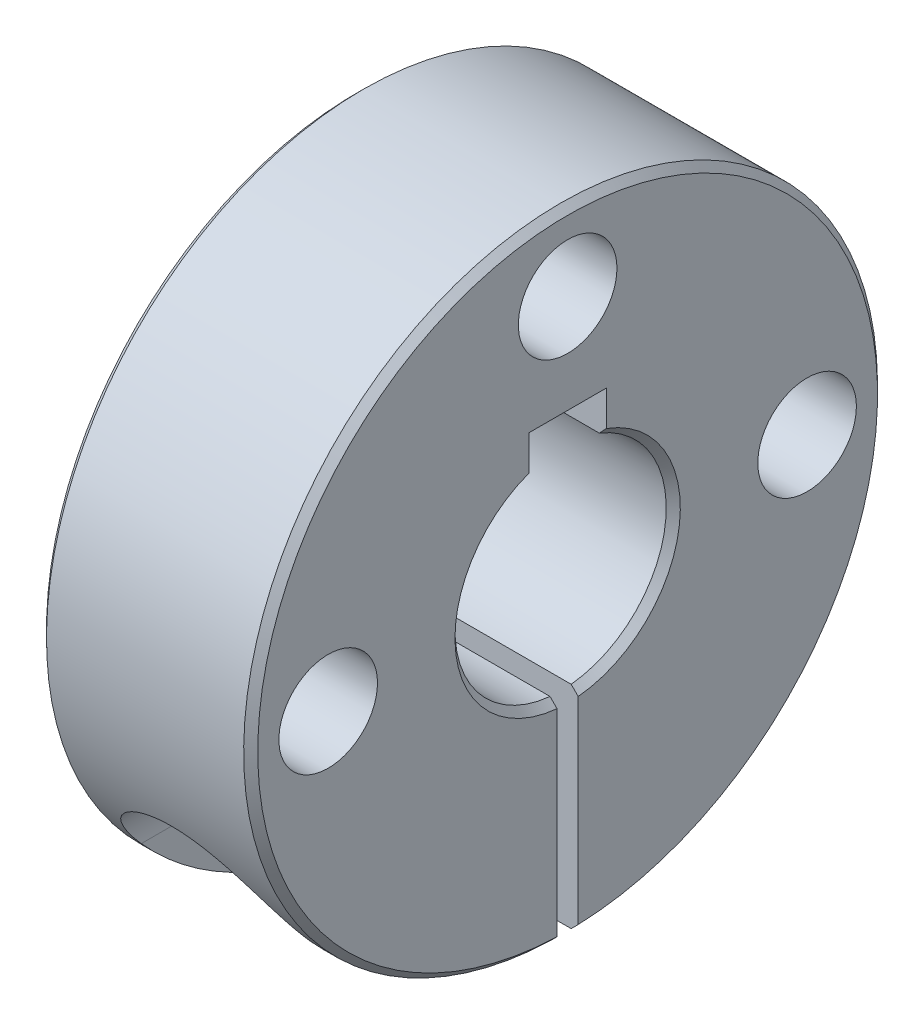
ISO-10303-21;
HEADER;
FILE_DESCRIPTION(('STEP AP214'),'2;1');
FILE_NAME('part.step','',(''),(''),'','','');
FILE_SCHEMA(('AUTOMOTIVE_DESIGN { 1 0 10303 214 1 1 1 1 }'));
ENDSEC;
DATA;
#1=APPLICATION_CONTEXT('core data for automotive mechanical design processes');
#2=APPLICATION_PROTOCOL_DEFINITION('international standard','automotive_design',2000,#1);
#3=PRODUCT_CONTEXT('',#1,'mechanical');
#4=PRODUCT('Part','Part','',(#3));
#5=PRODUCT_RELATED_PRODUCT_CATEGORY('part','',(#4));
#6=PRODUCT_DEFINITION_FORMATION('','',#4);
#7=PRODUCT_DEFINITION_CONTEXT('part definition',#1,'design');
#8=PRODUCT_DEFINITION('design','',#6,#7);
#9=PRODUCT_DEFINITION_SHAPE('','',#8);
#10=(LENGTH_UNIT() NAMED_UNIT(*) SI_UNIT(.MILLI.,.METRE.));
#11=(NAMED_UNIT(*) PLANE_ANGLE_UNIT() SI_UNIT($,.RADIAN.));
#12=(NAMED_UNIT(*) SI_UNIT($,.STERADIAN.) SOLID_ANGLE_UNIT());
#13=UNCERTAINTY_MEASURE_WITH_UNIT(LENGTH_MEASURE(1.E-05),#10,'distance_accuracy_value','');
#14=(GEOMETRIC_REPRESENTATION_CONTEXT(3) GLOBAL_UNCERTAINTY_ASSIGNED_CONTEXT((#13)) GLOBAL_UNIT_ASSIGNED_CONTEXT((#10,
#11,#12)) REPRESENTATION_CONTEXT('',''));
#15=CARTESIAN_POINT('',(0.,0.,0.));
#16=DIRECTION('',(0.,0.,1.));
#17=DIRECTION('',(1.,0.,0.));
#18=AXIS2_PLACEMENT_3D('',#15,#16,#17);
#19=CARTESIAN_POINT('',(7.5,-15.,-19.0328663106743));
#20=DIRECTION('',(0.,0.,-1.));
#21=DIRECTION('',(-1.,0.,0.));
#22=AXIS2_PLACEMENT_3D('',#19,#20,#21);
#23=CYLINDRICAL_SURFACE('',#22,2.4585);
#24=CARTESIAN_POINT('',(7.5,-15.,-0.75));
#25=DIRECTION('',(0.,0.,-1.));
#26=DIRECTION('',(-1.,0.,0.));
#27=AXIS2_PLACEMENT_3D('',#24,#25,#26);
#28=CIRCLE('',#27,2.4585);
#29=CARTESIAN_POINT('',(5.0415,-15.,-0.75));
#30=VERTEX_POINT('',#29);
#31=EDGE_CURVE('E199',#30,#30,#28,.T.);
#32=ORIENTED_EDGE('',*,*,#31,.F.);
#33=EDGE_LOOP('',(#32));
#34=FACE_BOUND('',#33,.T.);
#35=CARTESIAN_POINT('',(5.0415,-15.,-16.7705098312484));
#36=CARTESIAN_POINT('',(5.04149805708887,-14.8448717016041,-16.9092596748891));
#37=CARTESIAN_POINT('',(5.05614646984231,-14.6877579019284,-17.0458876681753));
#38=CARTESIAN_POINT('',(5.11733143065665,-14.3733206651101,-17.3118438136128));
#39=CARTESIAN_POINT('',(5.16386044941971,-14.2159972862183,-17.441173681571));
#40=CARTESIAN_POINT('',(5.2799979301912,-13.934844583986,-17.6662522580199));
#41=CARTESIAN_POINT('',(5.34387438287865,-13.8101247813252,-17.7638320716436));
#42=CARTESIAN_POINT('',(5.49615845072061,-13.568508720336,-17.9490567476726));
#43=CARTESIAN_POINT('',(5.58453358545304,-13.4516023558851,-18.0367145494847));
#44=CARTESIAN_POINT('',(5.76873546397706,-13.2500786427208,-18.1851126199185));
#45=CARTESIAN_POINT('',(5.86062918847246,-13.1633739513742,-18.2478862090267));
#46=CARTESIAN_POINT('',(6.06084648071676,-13.0026233156153,-18.3627759951126));
#47=CARTESIAN_POINT('',(6.16916625545982,-12.9285744571683,-18.4148946459581));
#48=CARTESIAN_POINT('',(6.40123790395823,-12.7966210070645,-18.5068376969926));
#49=CARTESIAN_POINT('',(6.52509564083756,-12.7388369486663,-18.5465705312411));
#50=CARTESIAN_POINT('',(6.78410818676765,-12.6440105328512,-18.6113499386235));
#51=CARTESIAN_POINT('',(6.91925385780343,-12.6069515811748,-18.6364082621623));
#52=CARTESIAN_POINT('',(7.17797979119086,-12.5596002676293,-18.6683459377838));
#53=CARTESIAN_POINT('',(7.30081070348311,-12.5464773927784,-18.6771495151521));
#54=CARTESIAN_POINT('',(7.54728515309059,-12.5388696030744,-18.6822584861454));
#55=CARTESIAN_POINT('',(7.67092829611995,-12.5443762285528,-18.678569552627));
#56=CARTESIAN_POINT('',(7.90696833040265,-12.5726956871567,-18.6595169394049));
#57=CARTESIAN_POINT('',(8.01957130850789,-12.594351038078,-18.6449339848885));
#58=CARTESIAN_POINT('',(8.23899627633861,-12.652450393094,-18.6055561801566));
#59=CARTESIAN_POINT('',(8.34581815307907,-12.6888946861034,-18.5807611304388));
#60=CARTESIAN_POINT('',(8.55454400663269,-12.7761824340762,-18.5208540485657));
#61=CARTESIAN_POINT('',(8.65618326237766,-12.8274472474156,-18.4854387793729));
#62=CARTESIAN_POINT('',(8.84890334037747,-12.9415445839094,-18.40573984105));
#63=CARTESIAN_POINT('',(8.93998051689279,-13.0043810820374,-18.3614531240409));
#64=CARTESIAN_POINT('',(9.11995503494366,-13.1467451838203,-18.2598340534047));
#65=CARTESIAN_POINT('',(9.20748452755103,-13.2273517455965,-18.2015987577938));
#66=CARTESIAN_POINT('',(9.36754963204914,-13.3968491223066,-18.0772094939121));
#67=CARTESIAN_POINT('',(9.44007748612919,-13.4857441891825,-18.0110514563293));
#68=CARTESIAN_POINT('',(9.58145882171293,-13.6850312893006,-17.8602370744533));
#69=CARTESIAN_POINT('',(9.64750948717731,-13.7964828946933,-17.7743600278865));
#70=CARTESIAN_POINT('',(9.75987667623086,-14.023646412335,-17.5956895255932));
#71=CARTESIAN_POINT('',(9.80618086720296,-14.1393609381203,-17.5028917899418));
#72=CARTESIAN_POINT('',(9.88805954143037,-14.3971937938277,-17.2917348502521));
#73=CARTESIAN_POINT('',(9.91925227684726,-14.5396896282218,-17.1721391519792));
#74=CARTESIAN_POINT('',(9.95633455626861,-14.8234885172997,-16.9277694894997));
#75=CARTESIAN_POINT('',(9.96220611579894,-14.9647906530859,-16.802991908324));
#76=CARTESIAN_POINT('',(9.94911631968409,-15.273285969913,-16.5235782007781));
#77=CARTESIAN_POINT('',(9.92461902573518,-15.4396080592885,-16.3682263755974));
#78=CARTESIAN_POINT('',(9.84294988667769,-15.7633781321064,-16.0566661142727));
#79=CARTESIAN_POINT('',(9.78574537643327,-15.9208170708645,-15.9004569766172));
#80=CARTESIAN_POINT('',(9.64314355170367,-16.2150488846174,-15.6001189780964));
#81=CARTESIAN_POINT('',(9.55953603771303,-16.3525068280859,-15.4558085633742));
#82=CARTESIAN_POINT('',(9.41172266071443,-16.5479616536886,-15.2454648488343));
#83=CARTESIAN_POINT('',(9.35873943948631,-16.6113050725796,-15.1763928050696));
#84=CARTESIAN_POINT('',(9.24495727107227,-16.7338793795904,-15.0411298246012));
#85=CARTESIAN_POINT('',(9.18416223116549,-16.7931123010229,-14.9749374695547));
#86=CARTESIAN_POINT('',(9.03655257573315,-16.9223216496664,-14.828922242295));
#87=CARTESIAN_POINT('',(8.94717077788985,-16.9908009887293,-14.750327640932));
#88=CARTESIAN_POINT('',(8.7542294173243,-17.1176447137008,-14.6029333683251));
#89=CARTESIAN_POINT('',(8.65069076362329,-17.1760237344887,-14.5341195514562));
#90=CARTESIAN_POINT('',(8.45474951584272,-17.2674894610327,-14.4252437975103));
#91=CARTESIAN_POINT('',(8.36529441329981,-17.3033037565795,-14.382211736811));
#92=CARTESIAN_POINT('',(8.1785116515811,-17.3650526934325,-14.3075958790189));
#93=CARTESIAN_POINT('',(8.08119543697899,-17.3910013940879,-14.2759957934842));
#94=CARTESIAN_POINT('',(7.89559056034136,-17.4280244286856,-14.230765849737));
#95=CARTESIAN_POINT('',(7.80811726767171,-17.4407389409386,-14.2151599993887));
#96=CARTESIAN_POINT('',(7.63102434494715,-17.4566117369034,-14.195663917851));
#97=CARTESIAN_POINT('',(7.54140603406875,-17.4597757492822,-14.1917666635124));
#98=CARTESIAN_POINT('',(7.36263279581217,-17.456287762876,-14.1960565854325));
#99=CARTESIAN_POINT('',(7.27347801948948,-17.4496327436432,-14.2042474801458));
#100=CARTESIAN_POINT('',(7.09815593651113,-17.4270510829086,-14.2319429359146));
#101=CARTESIAN_POINT('',(7.01199087540931,-17.4111176256079,-14.2514558138883));
#102=CARTESIAN_POINT('',(6.82284127304091,-17.3658862958975,-14.3065563340953));
#103=CARTESIAN_POINT('',(6.72126659746349,-17.3341984394044,-14.3449953994239));
#104=CARTESIAN_POINT('',(6.52754825135905,-17.2603896534046,-14.4337202546322));
#105=CARTESIAN_POINT('',(6.43542209422198,-17.2182498275037,-14.4840274931615));
#106=CARTESIAN_POINT('',(6.22295388233147,-17.1055850002505,-14.6170942586383));
#107=CARTESIAN_POINT('',(6.10782912798329,-17.0306957368097,-14.7044383285141));
#108=CARTESIAN_POINT('',(5.89674053255204,-16.8685716688077,-14.8901501919138));
#109=CARTESIAN_POINT('',(5.80082134331074,-16.7813088822863,-14.9885428632416));
#110=CARTESIAN_POINT('',(5.65140964301487,-16.6233222694923,-15.1632743506445));
#111=CARTESIAN_POINT('',(5.59357653982828,-16.5548623103737,-15.2380196772147));
#112=CARTESIAN_POINT('',(5.48672723057693,-16.4137856094124,-15.389880256801));
#113=CARTESIAN_POINT('',(5.43771495389347,-16.34116703394,-15.466996548181));
#114=CARTESIAN_POINT('',(5.30353964895295,-16.1180046417889,-15.7005106810989));
#115=CARTESIAN_POINT('',(5.23111192831988,-15.962016929163,-15.8592266012985));
#116=CARTESIAN_POINT('',(5.13150338194107,-15.6728543038539,-16.144476483264));
#117=CARTESIAN_POINT('',(5.09806720606707,-15.5416211576268,-16.270887259593));
#118=CARTESIAN_POINT('',(5.05307042057751,-15.2741132936722,-16.5222600470746));
#119=CARTESIAN_POINT('',(5.04150172638882,-15.1378404581611,-16.6472225766664));
#120=CARTESIAN_POINT('',(5.0415,-15.,-16.7705098312484));
#121=B_SPLINE_CURVE_WITH_KNOTS('',3,(#35,#36,#37,#38,#39,#40,#41,#42,#43,#44,#45,#46,#47,#48,
#49,#50,#51,#52,#53,#54,#55,#56,#57,#58,#59,#60,#61,#62,#63,#64,#65,#66,#67,#68,#69,#70,#71,#72,
#73,#74,#75,#76,#77,#78,#79,#80,#81,#82,#83,#84,#85,#86,#87,#88,#89,#90,#91,#92,#93,#94,#95,#96,
#97,#98,#99,#100,#101,#102,#103,#104,#105,#106,#107,#108,#109,#110,#111,#112,#113,#114,#115,
#116,#117,#118,#119,#120),.UNSPECIFIED.,.T.,.F.,(4,2,2,2,2,2,2,2,2,2,2,2,2,2,2,2,2,2,2,2,2,2,2,
2,2,2,2,2,2,2,2,2,2,2,2,2,2,2,2,2,2,2,4),(0.,0.623879036716698,1.24761078160696,
1.75797422055942,2.26766422794611,2.68919245338355,3.11062348983253,3.53509999062979,
3.95923613152967,4.32879860815748,4.69819328874839,5.04338645417141,5.38858636356693,
5.74477274426176,6.1010817070546,6.49700018532095,6.89312289618155,7.35772612573821,
7.82261909876417,8.38646625926096,8.95071382874173,9.63473611760575,10.3194427449652,
10.9651811988314,11.287833395699,11.6103248335522,12.0210873456447,12.4312496051375,
12.7467203400178,13.0617398007366,13.3298220334422,13.5977434306571,13.8657472607772,
14.1339482112132,14.4714787016418,14.809623928214,15.2952434005887,15.7819791252261,
16.1316288004162,16.4814338493037,17.1803292166457,17.734886859709,18.2892394384928),.UNSPECIFIED.);
#122=CARTESIAN_POINT('',(5.0415,-15.,-16.7705098312484));
#123=VERTEX_POINT('',#122);
#124=EDGE_CURVE('E245',#123,#123,#121,.F.);
#125=ORIENTED_EDGE('',*,*,#124,.F.);
#126=EDGE_LOOP('',(#125));
#127=FACE_BOUND('',#126,.T.);
#128=ADVANCED_FACE('F17',(#34,#127),#23,.F.);
#129=CARTESIAN_POINT('',(7.5,-15.,8.));
#130=DIRECTION('',(0.,0.,1.));
#131=DIRECTION('',(1.,0.,0.));
#132=AXIS2_PLACEMENT_3D('',#129,#130,#131);
#133=PLANE('',#132);
#134=DIRECTION('',(0.,1.,0.));
#135=VECTOR('',#134,1.);
#136=CARTESIAN_POINT('',(13.5,-45.,8.));
#137=LINE('',#136,#135);
#138=CARTESIAN_POINT('',(13.5,-21.0297408448131,8.));
#139=VERTEX_POINT('',#138);
#140=CARTESIAN_POINT('',(13.5,-15.,8.));
#141=VERTEX_POINT('',#140);
#142=EDGE_CURVE('E10',#139,#141,#137,.T.);
#143=ORIENTED_EDGE('',*,*,#142,.T.);
#144=CARTESIAN_POINT('',(7.5,-15.,8.));
#145=DIRECTION('',(0.,0.,1.));
#146=DIRECTION('',(1.,0.,0.));
#147=AXIS2_PLACEMENT_3D('',#144,#145,#146);
#148=CIRCLE('',#147,6.);
#149=CARTESIAN_POINT('',(1.5,-15.,8.));
#150=VERTEX_POINT('',#149);
#151=EDGE_CURVE('E313',#141,#150,#148,.T.);
#152=ORIENTED_EDGE('',*,*,#151,.T.);
#153=DIRECTION('',(0.,-1.,0.));
#154=VECTOR('',#153,1.);
#155=CARTESIAN_POINT('',(1.5,-15.,8.));
#156=LINE('',#155,#154);
#157=CARTESIAN_POINT('',(1.5,-21.0297408448131,8.));
#158=VERTEX_POINT('',#157);
#159=EDGE_CURVE('E34',#150,#158,#156,.T.);
#160=ORIENTED_EDGE('',*,*,#159,.T.);
#161=DIRECTION('',(-1.,0.,0.));
#162=VECTOR('',#161,1.);
#163=CARTESIAN_POINT('',(15.,-21.0297408448131,8.));
#164=LINE('',#163,#162);
#165=EDGE_CURVE('E254',#139,#158,#164,.T.);
#166=ORIENTED_EDGE('',*,*,#165,.F.);
#167=EDGE_LOOP('',(#143,#152,#160,#166));
#168=FACE_BOUND('',#167,.T.);
#169=CARTESIAN_POINT('',(7.5,-15.,8.));
#170=DIRECTION('',(0.,0.,1.));
#171=DIRECTION('',(1.,0.,0.));
#172=AXIS2_PLACEMENT_3D('',#169,#170,#171);
#173=CIRCLE('',#172,3.5);
#174=CARTESIAN_POINT('',(11.,-15.,8.));
#175=VERTEX_POINT('',#174);
#176=EDGE_CURVE('E253',#175,#175,#173,.T.);
#177=ORIENTED_EDGE('',*,*,#176,.F.);
#178=EDGE_LOOP('',(#177));
#179=FACE_BOUND('',#178,.T.);
#180=ADVANCED_FACE('F19',(#168,#179),#133,.T.);
#181=CARTESIAN_POINT('',(13.5,-45.,30.5));
#182=DIRECTION('',(-1.,0.,0.));
#183=DIRECTION('',(0.,0.,1.));
#184=AXIS2_PLACEMENT_3D('',#181,#182,#183);
#185=PLANE('',#184);
#186=DIRECTION('',(0.,0.,-1.));
#187=VECTOR('',#186,1.);
#188=CARTESIAN_POINT('',(13.5,-15.,30.5));
#189=LINE('',#188,#187);
#190=CARTESIAN_POINT('',(13.5,-15.,16.7705098312484));
#191=VERTEX_POINT('',#190);
#192=EDGE_CURVE('E243',#191,#141,#189,.T.);
#193=ORIENTED_EDGE('',*,*,#192,.T.);
#194=ORIENTED_EDGE('',*,*,#142,.F.);
#195=CARTESIAN_POINT('',(13.5,0.,0.));
#196=DIRECTION('',(1.,0.,0.));
#197=DIRECTION('',(0.,0.,1.));
#198=AXIS2_PLACEMENT_3D('',#195,#196,#197);
#199=CIRCLE('',#198,22.5);
#200=EDGE_CURVE('E310',#191,#139,#199,.T.);
#201=ORIENTED_EDGE('',*,*,#200,.F.);
#202=EDGE_LOOP('',(#193,#194,#201));
#203=FACE_BOUND('',#202,.T.);
#204=ADVANCED_FACE('F300',(#203),#185,.T.);
#205=CARTESIAN_POINT('',(1.5,-15.,30.5));
#206=DIRECTION('',(1.,0.,0.));
#207=DIRECTION('',(0.,1.,0.));
#208=AXIS2_PLACEMENT_3D('',#205,#206,#207);
#209=PLANE('',#208);
#210=ORIENTED_EDGE('',*,*,#159,.F.);
#211=DIRECTION('',(0.,0.,-1.));
#212=VECTOR('',#211,1.);
#213=CARTESIAN_POINT('',(1.5,-15.,30.5));
#214=LINE('',#213,#212);
#215=CARTESIAN_POINT('',(1.5,-15.,16.7705098312484));
#216=VERTEX_POINT('',#215);
#217=EDGE_CURVE('E63',#216,#150,#214,.T.);
#218=ORIENTED_EDGE('',*,*,#217,.F.);
#219=CARTESIAN_POINT('',(1.5,0.,0.));
#220=DIRECTION('',(-1.,0.,0.));
#221=DIRECTION('',(0.,0.,-1.));
#222=AXIS2_PLACEMENT_3D('',#219,#220,#221);
#223=CIRCLE('',#222,22.5);
#224=EDGE_CURVE('E502',#158,#216,#223,.T.);
#225=ORIENTED_EDGE('',*,*,#224,.F.);
#226=EDGE_LOOP('',(#210,#218,#225));
#227=FACE_BOUND('',#226,.T.);
#228=ADVANCED_FACE('F297',(#227),#209,.T.);
#229=CARTESIAN_POINT('',(7.5,-15.,30.5));
#230=DIRECTION('',(0.,0.,-1.));
#231=DIRECTION('',(-1.,0.,0.));
#232=AXIS2_PLACEMENT_3D('',#229,#230,#231);
#233=CYLINDRICAL_SURFACE('',#232,6.);
#234=ORIENTED_EDGE('',*,*,#217,.T.);
#235=ORIENTED_EDGE('',*,*,#151,.F.);
#236=ORIENTED_EDGE('',*,*,#192,.F.);
#237=CARTESIAN_POINT('',(1.5,-15.,16.7705098312484));
#238=CARTESIAN_POINT('',(1.500000951378,-14.8106485336108,16.9399303869875));
#239=CARTESIAN_POINT('',(1.50896822754426,-14.6182594467692,17.1061766364176));
#240=CARTESIAN_POINT('',(1.5465540069012,-14.2287222697893,17.4315077661411));
#241=CARTESIAN_POINT('',(1.57521406234586,-14.0315649689206,17.5905767444434));
#242=CARTESIAN_POINT('',(1.6541470620048,-13.6334700076549,17.9009129863554));
#243=CARTESIAN_POINT('',(1.7045446792961,-13.4325170337583,18.0521295208695));
#244=CARTESIAN_POINT('',(1.82853841724849,-13.0305610184167,18.3443744353908));
#245=CARTESIAN_POINT('',(1.90211208711868,-12.8295582127447,18.4854125135012));
#246=CARTESIAN_POINT('',(2.04934660318448,-12.4871170924922,18.7176865699939));
#247=CARTESIAN_POINT('',(2.11704864842377,-12.3449743947352,18.8116908607258));
#248=CARTESIAN_POINT('',(2.26531302121939,-12.0634465533976,18.993454117618));
#249=CARTESIAN_POINT('',(2.34587227724981,-11.9240607601219,19.0812145681805));
#250=CARTESIAN_POINT('',(2.51979840606387,-11.6497919129206,19.2498886023095));
#251=CARTESIAN_POINT('',(2.61313284517025,-11.5148984989149,19.330818711431));
#252=CARTESIAN_POINT('',(2.81266617821384,-11.2508305862209,19.4856929714747));
#253=CARTESIAN_POINT('',(2.91885900473657,-11.1216534292231,19.559640388188));
#254=CARTESIAN_POINT('',(3.14464899244731,-10.8696567884864,19.7008012291793));
#255=CARTESIAN_POINT('',(3.26433462571748,-10.7468880320955,19.7679639929865));
#256=CARTESIAN_POINT('',(3.51596065486526,-10.5103175447491,19.8947541572559));
#257=CARTESIAN_POINT('',(3.6479013738643,-10.3965160503735,19.9543813589352));
#258=CARTESIAN_POINT('',(3.92330301678877,-10.1794192319558,20.0659995396789));
#259=CARTESIAN_POINT('',(4.06676999173333,-10.0761294916912,20.1179864667217));
#260=CARTESIAN_POINT('',(4.36410436863273,-9.88163030343239,20.2142317212676));
#261=CARTESIAN_POINT('',(4.51797068758685,-9.79041960043092,20.2584908518383));
#262=CARTESIAN_POINT('',(4.81899801192788,-9.62986415729205,20.3352607036786));
#263=CARTESIAN_POINT('',(4.96529500793038,-9.55924555196308,20.3685031765892));
#264=CARTESIAN_POINT('',(5.26422140473049,-9.42973785811279,20.4287823833869));
#265=CARTESIAN_POINT('',(5.4168504284813,-9.37084807239524,20.4558194861544));
#266=CARTESIAN_POINT('',(5.72721320444403,-9.26553653739653,20.5037357949938));
#267=CARTESIAN_POINT('',(5.8849446970508,-9.21910935156107,20.5246176865421));
#268=CARTESIAN_POINT('',(6.20433785789574,-9.13925313667977,20.5603007964319));
#269=CARTESIAN_POINT('',(6.36599942777311,-9.10582378268317,20.5751021667893));
#270=CARTESIAN_POINT('',(6.68323185309016,-9.05379704496159,20.5980465361597));
#271=CARTESIAN_POINT('',(6.83866611032946,-9.0345020996416,20.6065032730439));
#272=CARTESIAN_POINT('',(7.1508202120985,-9.0081210095459,20.6180495000821));
#273=CARTESIAN_POINT('',(7.30754046571617,-9.00103891407458,20.6211372100791));
#274=CARTESIAN_POINT('',(7.6209950058462,-8.99917388674504,20.6219511699819));
#275=CARTESIAN_POINT('',(7.77772925266206,-9.00438529260769,20.6196798881923));
#276=CARTESIAN_POINT('',(8.0901985457147,-9.02704330811364,20.6097705401234));
#277=CARTESIAN_POINT('',(8.24593320345961,-9.04449441478249,20.6021305012908));
#278=CARTESIAN_POINT('',(8.55314553943211,-9.09113370934588,20.5815919230412));
#279=CARTESIAN_POINT('',(8.70465229237643,-9.12016216308867,20.568764916662));
#280=CARTESIAN_POINT('',(9.00452520719865,-9.18965574771392,20.5378108112651));
#281=CARTESIAN_POINT('',(9.15289021511799,-9.23012500507189,20.5196817998358));
#282=CARTESIAN_POINT('',(9.445359460735,-9.32205427341683,20.4780820906554));
#283=CARTESIAN_POINT('',(9.58946483826172,-9.37351131332606,20.4546128367845));
#284=CARTESIAN_POINT('',(9.87249438231509,-9.48687828442112,20.4022801462557));
#285=CARTESIAN_POINT('',(10.0114183573074,-9.54878860155337,20.3734165104271));
#286=CARTESIAN_POINT('',(10.284441172298,-9.68302335225503,20.3099635037517));
#287=CARTESIAN_POINT('',(10.4184835179041,-9.75543878812797,20.2753236569052));
#288=CARTESIAN_POINT('',(10.6795440407783,-9.90947244139627,20.2004872223853));
#289=CARTESIAN_POINT('',(10.8065620509324,-9.99109087759732,20.1602905025895));
#290=CARTESIAN_POINT('',(11.0528334610747,-10.1626563727496,20.0743521796826));
#291=CARTESIAN_POINT('',(11.1720876976641,-10.2526025317917,20.0286111755325));
#292=CARTESIAN_POINT('',(11.4022817632459,-10.4399312569512,19.9316071096954));
#293=CARTESIAN_POINT('',(11.5132186514118,-10.5373164289939,19.8803421103178));
#294=CARTESIAN_POINT('',(11.7304596536649,-10.7424885449642,19.7702558689777));
#295=CARTESIAN_POINT('',(11.8364087365686,-10.8505342001137,19.7112164176583));
#296=CARTESIAN_POINT('',(12.0384164053606,-11.0724936750401,19.587394865546));
#297=CARTESIAN_POINT('',(12.1344713706022,-11.18640962027,19.5226106785528));
#298=CARTESIAN_POINT('',(12.3163908223684,-11.4189163619954,19.3875324380788));
#299=CARTESIAN_POINT('',(12.4022591405716,-11.5375053782246,19.3172404729594));
#300=CARTESIAN_POINT('',(12.5637997061125,-11.7783588458332,19.1713354359286));
#301=CARTESIAN_POINT('',(12.6394681884482,-11.9006246341393,19.0957204147428));
#302=CARTESIAN_POINT('',(12.7872259639653,-12.159322812498,18.9321523902744));
#303=CARTESIAN_POINT('',(12.8583214257917,-12.2960120459913,18.8437065948681));
#304=CARTESIAN_POINT('',(12.9885983796461,-12.5713150873427,18.6611736383502));
#305=CARTESIAN_POINT('',(13.0477752057805,-12.7099296263053,18.56708428654));
#306=CARTESIAN_POINT('',(13.2080092666898,-13.1272048232357,18.2767856738779));
#307=CARTESIAN_POINT('',(13.2917058071295,-13.4071817341308,18.0726182088251));
#308=CARTESIAN_POINT('',(13.4044714321253,-13.9090873532804,17.6880564702358));
#309=CARTESIAN_POINT('',(13.4409729964909,-14.131774786029,17.5106962881796));
#310=CARTESIAN_POINT('',(13.4767829159723,-14.4612969678006,17.2377823659765));
#311=CARTESIAN_POINT('',(13.4855636823528,-14.5701794103981,17.1458503238178));
#312=CARTESIAN_POINT('',(13.497171277786,-14.7863434128641,16.9597880328878));
#313=CARTESIAN_POINT('',(13.4999990940654,-14.8936252352459,16.8656581512207));
#314=CARTESIAN_POINT('',(13.5,-15.,16.7705098312484));
#315=B_SPLINE_CURVE_WITH_KNOTS('',3,(#237,#238,#239,#240,#241,#242,#243,#244,#245,#246,#247,
#248,#249,#250,#251,#252,#253,#254,#255,#256,#257,#258,#259,#260,#261,#262,#263,#264,#265,#266,
#267,#268,#269,#270,#271,#272,#273,#274,#275,#276,#277,#278,#279,#280,#281,#282,#283,#284,#285,
#286,#287,#288,#289,#290,#291,#292,#293,#294,#295,#296,#297,#298,#299,#300,#301,#302,#303,#304,
#305,#306,#307,#308,#309,#310,#311,#312,#313,#314),.UNSPECIFIED.,.F.,.F.,(4,2,2,2,2,2,2,2,2,2,2,
2,2,2,2,2,2,2,2,2,2,2,2,2,2,2,2,2,2,2,2,2,2,2,2,2,2,2,4),(0.,0.762272128167132,1.52615762867283,
2.29448380400111,3.06206797387398,3.61166034808455,4.16112162330426,4.70921294144387,
5.25704663537299,5.80870804953565,6.36038401310776,6.91235151045024,7.4642616135149,
7.96107534323943,8.45785953204481,8.9544266554264,9.45098136364176,9.92098211404376,
10.3911386684114,10.8610787150686,11.3311915143322,11.7950308527549,12.2590377029248,
12.7229192449517,13.1868179177387,13.6550060981414,14.1232054122885,14.5913541908731,
15.0596677232109,15.5464428176735,16.0333954141353,16.5201642600395,17.0071122947264,
17.5395257846583,18.0721472997945,19.1378377151753,19.9975155960076,20.4256971977294,
20.8538077849794),.UNSPECIFIED.);
#316=EDGE_CURVE('E21',#216,#191,#315,.T.);
#317=ORIENTED_EDGE('',*,*,#316,.F.);
#318=EDGE_LOOP('',(#234,#235,#236,#317));
#319=FACE_BOUND('',#318,.T.);
#320=ADVANCED_FACE('F293',(#319),#233,.F.);
#321=CARTESIAN_POINT('',(15.,10.,-2.75));
#322=DIRECTION('',(0.,-1.,0.));
#323=DIRECTION('',(0.,0.,-1.));
#324=AXIS2_PLACEMENT_3D('',#321,#322,#323);
#325=PLANE('',#324);
#326=DIRECTION('',(0.,0.,1.));
#327=VECTOR('',#326,1.);
#328=CARTESIAN_POINT('',(0.,10.,-2.75));
#329=LINE('',#328,#327);
#330=CARTESIAN_POINT('',(0.,10.,-2.75));
#331=VERTEX_POINT('',#330);
#332=CARTESIAN_POINT('',(0.,10.,2.75));
#333=VERTEX_POINT('',#332);
#334=EDGE_CURVE('E333',#331,#333,#329,.T.);
#335=ORIENTED_EDGE('',*,*,#334,.F.);
#336=DIRECTION('',(-1.,0.,0.));
#337=VECTOR('',#336,1.);
#338=CARTESIAN_POINT('',(15.,10.,-2.75));
#339=LINE('',#338,#337);
#340=CARTESIAN_POINT('',(15.,10.,-2.75));
#341=VERTEX_POINT('',#340);
#342=EDGE_CURVE('E198',#341,#331,#339,.T.);
#343=ORIENTED_EDGE('',*,*,#342,.F.);
#344=DIRECTION('',(0.,0.,1.));
#345=VECTOR('',#344,1.);
#346=CARTESIAN_POINT('',(15.,10.,-2.75));
#347=LINE('',#346,#345);
#348=CARTESIAN_POINT('',(15.,10.,2.75));
#349=VERTEX_POINT('',#348);
#350=EDGE_CURVE('E202',#341,#349,#347,.T.);
#351=ORIENTED_EDGE('',*,*,#350,.T.);
#352=DIRECTION('',(-1.,0.,0.));
#353=VECTOR('',#352,1.);
#354=CARTESIAN_POINT('',(15.,10.,2.75));
#355=LINE('',#354,#353);
#356=EDGE_CURVE('E186',#349,#333,#355,.T.);
#357=ORIENTED_EDGE('',*,*,#356,.T.);
#358=EDGE_LOOP('',(#335,#343,#351,#357));
#359=FACE_BOUND('',#358,.T.);
#360=ADVANCED_FACE('F203',(#359),#325,.T.);
#361=CARTESIAN_POINT('',(15.,0.,-2.75));
#362=DIRECTION('',(0.,0.,1.));
#363=DIRECTION('',(1.,0.,0.));
#364=AXIS2_PLACEMENT_3D('',#361,#362,#363);
#365=PLANE('',#364);
#366=DIRECTION('',(-1.,0.,0.));
#367=VECTOR('',#366,1.);
#368=CARTESIAN_POINT('',(15.,6.97764286847643,-2.75));
#369=LINE('',#368,#367);
#370=CARTESIAN_POINT('',(14.5,6.97764286847643,-2.75));
#371=VERTEX_POINT('',#370);
#372=CARTESIAN_POINT('',(0.5,6.97764286847643,-2.75));
#373=VERTEX_POINT('',#372);
#374=EDGE_CURVE('E327',#371,#373,#369,.T.);
#375=ORIENTED_EDGE('',*,*,#374,.F.);
#376=CARTESIAN_POINT('',(15.,7.51248960065836,-2.75));
#377=CARTESIAN_POINT('',(14.832926295652,7.33457392877952,-2.75));
#378=CARTESIAN_POINT('',(14.6662306403141,7.15631779149213,-2.75));
#379=CARTESIAN_POINT('',(14.5,6.97764286847643,-2.75));
#380=B_SPLINE_CURVE_WITH_KNOTS('',3,(#376,#377,#378,#379),.UNSPECIFIED.,.F.,.F.,(4,4),
(1.0223492895291E-06,0.000733057601059994),.UNSPECIFIED.);
#381=CARTESIAN_POINT('',(15.,7.51248960065836,-2.75));
#382=VERTEX_POINT('',#381);
#383=EDGE_CURVE('E407',#382,#371,#380,.T.);
#384=ORIENTED_EDGE('',*,*,#383,.F.);
#385=DIRECTION('',(0.,1.,0.));
#386=VECTOR('',#385,1.);
#387=CARTESIAN_POINT('',(15.,0.,-2.75));
#388=LINE('',#387,#386);
#389=EDGE_CURVE('E207',#382,#341,#388,.T.);
#390=ORIENTED_EDGE('',*,*,#389,.T.);
#391=ORIENTED_EDGE('',*,*,#342,.T.);
#392=DIRECTION('',(0.,1.,0.));
#393=VECTOR('',#392,1.);
#394=CARTESIAN_POINT('',(0.,0.,-2.75));
#395=LINE('',#394,#393);
#396=CARTESIAN_POINT('',(0.,7.51248960065836,-2.75));
#397=VERTEX_POINT('',#396);
#398=EDGE_CURVE('E362',#397,#331,#395,.T.);
#399=ORIENTED_EDGE('',*,*,#398,.F.);
#400=CARTESIAN_POINT('',(0.5,6.97764286847643,-2.75));
#401=CARTESIAN_POINT('',(0.333776706221638,7.15630989498333,-2.75));
#402=CARTESIAN_POINT('',(0.167080597829464,7.33456658795715,-2.75));
#403=CARTESIAN_POINT('',(0.,7.51248960065837,-2.75));
#404=B_SPLINE_CURVE_WITH_KNOTS('',3,(#400,#401,#402,#403),.UNSPECIFIED.,.F.,.F.,(4,4),
(0.00859991918946598,0.00933358809477891),.UNSPECIFIED.);
#405=EDGE_CURVE('E385',#373,#397,#404,.T.);
#406=ORIENTED_EDGE('',*,*,#405,.F.);
#407=EDGE_LOOP('',(#375,#384,#390,#391,#399,#406));
#408=FACE_BOUND('',#407,.T.);
#409=ADVANCED_FACE('F288',(#408),#365,.T.);
#410=CARTESIAN_POINT('',(15.,10.,2.75));
#411=DIRECTION('',(0.,0.,-1.));
#412=DIRECTION('',(0.,-1.,0.));
#413=AXIS2_PLACEMENT_3D('',#410,#411,#412);
#414=PLANE('',#413);
#415=DIRECTION('',(0.,-1.,0.));
#416=VECTOR('',#415,1.);
#417=CARTESIAN_POINT('',(0.,10.,2.75));
#418=LINE('',#417,#416);
#419=CARTESIAN_POINT('',(0.,7.51248960065836,2.75));
#420=VERTEX_POINT('',#419);
#421=EDGE_CURVE('E193',#333,#420,#418,.T.);
#422=ORIENTED_EDGE('',*,*,#421,.F.);
#423=ORIENTED_EDGE('',*,*,#356,.F.);
#424=DIRECTION('',(0.,-1.,0.));
#425=VECTOR('',#424,1.);
#426=CARTESIAN_POINT('',(15.,10.,2.75));
#427=LINE('',#426,#425);
#428=CARTESIAN_POINT('',(15.,7.51248960065836,2.75));
#429=VERTEX_POINT('',#428);
#430=EDGE_CURVE('E190',#349,#429,#427,.T.);
#431=ORIENTED_EDGE('',*,*,#430,.T.);
#432=CARTESIAN_POINT('',(14.5,6.97764286847643,2.75));
#433=CARTESIAN_POINT('',(14.6662232937784,7.15630989498333,2.75));
#434=CARTESIAN_POINT('',(14.8329194021705,7.33456658795715,2.75));
#435=CARTESIAN_POINT('',(15.,7.51248960065837,2.75));
#436=B_SPLINE_CURVE_WITH_KNOTS('',3,(#432,#433,#434,#435),.UNSPECIFIED.,.F.,.F.,(4,4),
(0.00859991918946597,0.0093335880947789),.UNSPECIFIED.);
#437=CARTESIAN_POINT('',(14.5,6.97764286847643,2.75));
#438=VERTEX_POINT('',#437);
#439=EDGE_CURVE('E400',#438,#429,#436,.T.);
#440=ORIENTED_EDGE('',*,*,#439,.F.);
#441=DIRECTION('',(1.,0.,0.));
#442=VECTOR('',#441,1.);
#443=CARTESIAN_POINT('',(15.,6.97764286847643,2.75));
#444=LINE('',#443,#442);
#445=CARTESIAN_POINT('',(0.5,6.97764286847643,2.75));
#446=VERTEX_POINT('',#445);
#447=EDGE_CURVE('E387',#446,#438,#444,.T.);
#448=ORIENTED_EDGE('',*,*,#447,.F.);
#449=CARTESIAN_POINT('',(0.,7.51248960065836,2.75));
#450=CARTESIAN_POINT('',(0.167073704347987,7.33457392877952,2.75));
#451=CARTESIAN_POINT('',(0.333769359685857,7.15631779149213,2.75));
#452=CARTESIAN_POINT('',(0.5,6.97764286847643,2.75));
#453=B_SPLINE_CURVE_WITH_KNOTS('',3,(#449,#450,#451,#452),.UNSPECIFIED.,.F.,.F.,(4,4),
(1.02234928952702E-06,0.000733057601059993),.UNSPECIFIED.);
#454=EDGE_CURVE('E380',#420,#446,#453,.T.);
#455=ORIENTED_EDGE('',*,*,#454,.F.);
#456=EDGE_LOOP('',(#422,#423,#431,#440,#448,#455));
#457=FACE_BOUND('',#456,.T.);
#458=ADVANCED_FACE('F188',(#457),#414,.T.);
#459=CARTESIAN_POINT('',(15.,0.,0.75));
#460=DIRECTION('',(0.,0.,-1.));
#461=DIRECTION('',(0.,-1.,0.));
#462=AXIS2_PLACEMENT_3D('',#459,#460,#461);
#463=PLANE('',#462);
#464=DIRECTION('',(-1.,0.,0.));
#465=VECTOR('',#464,1.);
#466=CARTESIAN_POINT('',(15.,-7.46240577829965,0.75));
#467=LINE('',#466,#465);
#468=CARTESIAN_POINT('',(14.5,-7.46240577829965,0.75));
#469=VERTEX_POINT('',#468);
#470=CARTESIAN_POINT('',(0.5,-7.46240577829965,0.75));
#471=VERTEX_POINT('',#470);
#472=EDGE_CURVE('E395',#469,#471,#467,.T.);
#473=ORIENTED_EDGE('',*,*,#472,.F.);
#474=CARTESIAN_POINT('',(15.,-7.96476616103699,0.75));
#475=CARTESIAN_POINT('',(14.8333085545415,-7.79733732047774,0.75));
#476=CARTESIAN_POINT('',(14.6666402279217,-7.62988550890442,0.75));
#477=CARTESIAN_POINT('',(14.5,-7.46240577829965,0.75));
#478=B_SPLINE_CURVE_WITH_KNOTS('',3,(#474,#475,#476,#477),.UNSPECIFIED.,.F.,.F.,(4,4),
(0.0113485385099862,0.012057316041416),.UNSPECIFIED.);
#479=CARTESIAN_POINT('',(15.,-7.96476616103699,0.75));
#480=VERTEX_POINT('',#479);
#481=EDGE_CURVE('E403',#480,#469,#478,.T.);
#482=ORIENTED_EDGE('',*,*,#481,.F.);
#483=DIRECTION('',(0.,-1.,0.));
#484=VECTOR('',#483,1.);
#485=CARTESIAN_POINT('',(15.,0.,0.75));
#486=LINE('',#485,#484);
#487=CARTESIAN_POINT('',(15.,-21.987212192545,0.75));
#488=VERTEX_POINT('',#487);
#489=EDGE_CURVE('E215',#480,#488,#486,.T.);
#490=ORIENTED_EDGE('',*,*,#489,.T.);
#491=DIRECTION('',(0.706910226135865,0.707303281615843,0.));
#492=VECTOR('',#491,1.);
#493=CARTESIAN_POINT('',(14.7500007995677,-22.2373551581168,0.75));
#494=LINE('',#493,#492);
#495=CARTESIAN_POINT('',(14.5,-22.4874965258474,0.75));
#496=VERTEX_POINT('',#495);
#497=EDGE_CURVE('E423',#496,#488,#494,.T.);
#498=ORIENTED_EDGE('',*,*,#497,.F.);
#499=DIRECTION('',(1.,0.,0.));
#500=VECTOR('',#499,1.);
#501=CARTESIAN_POINT('',(15.,-22.4874965258474,0.75));
#502=LINE('',#501,#500);
#503=CARTESIAN_POINT('',(0.5,-22.4874965258474,0.75));
#504=VERTEX_POINT('',#503);
#505=EDGE_CURVE('E494',#504,#496,#502,.T.);
#506=ORIENTED_EDGE('',*,*,#505,.F.);
#507=DIRECTION('',(0.70690118372052,-0.707312318890692,0.));
#508=VECTOR('',#507,1.);
#509=CARTESIAN_POINT('',(0.249999200635407,-22.23735515832,0.75));
#510=LINE('',#509,#508);
#511=CARTESIAN_POINT('',(0.,-21.987212192545,0.75));
#512=VERTEX_POINT('',#511);
#513=EDGE_CURVE('E343',#512,#504,#510,.T.);
#514=ORIENTED_EDGE('',*,*,#513,.F.);
#515=DIRECTION('',(0.,-1.,0.));
#516=VECTOR('',#515,1.);
#517=CARTESIAN_POINT('',(0.,0.,0.75));
#518=LINE('',#517,#516);
#519=CARTESIAN_POINT('',(0.,-7.96476616103699,0.75));
#520=VERTEX_POINT('',#519);
#521=EDGE_CURVE('E334',#520,#512,#518,.T.);
#522=ORIENTED_EDGE('',*,*,#521,.F.);
#523=CARTESIAN_POINT('',(0.5,-7.46240577829965,0.75));
#524=CARTESIAN_POINT('',(0.333359733370818,-7.62988554780686,0.75));
#525=CARTESIAN_POINT('',(0.166691409170182,-7.79733735692659,0.75));
#526=CARTESIAN_POINT('',(0.,-7.96476616103699,0.75));
#527=B_SPLINE_CURVE_WITH_KNOTS('',3,(#523,#524,#525,#526),.UNSPECIFIED.,.F.,.F.,(4,4),
(0.021019712248209,0.0217274298524484),.UNSPECIFIED.);
#528=EDGE_CURVE('E379',#471,#520,#527,.T.);
#529=ORIENTED_EDGE('',*,*,#528,.F.);
#530=EDGE_LOOP('',(#473,#482,#490,#498,#506,#514,#522,#529));
#531=FACE_BOUND('',#530,.T.);
#532=CARTESIAN_POINT('',(7.5,-15.,0.75));
#533=DIRECTION('',(0.,0.,1.));
#534=DIRECTION('',(-1.,0.,0.));
#535=AXIS2_PLACEMENT_3D('',#532,#533,#534);
#536=CIRCLE('',#535,3.5);
#537=CARTESIAN_POINT('',(4.,-15.,0.75));
#538=VERTEX_POINT('',#537);
#539=EDGE_CURVE('E329',#538,#538,#536,.T.);
#540=ORIENTED_EDGE('',*,*,#539,.T.);
#541=EDGE_LOOP('',(#540));
#542=FACE_BOUND('',#541,.T.);
#543=ADVANCED_FACE('F281',(#531,#542),#463,.T.);
#544=CARTESIAN_POINT('',(15.,-22.5,-0.75));
#545=DIRECTION('',(0.,0.,1.));
#546=DIRECTION('',(1.,0.,0.));
#547=AXIS2_PLACEMENT_3D('',#544,#545,#546);
#548=PLANE('',#547);
#549=DIRECTION('',(0.,1.,0.));
#550=VECTOR('',#549,1.);
#551=CARTESIAN_POINT('',(0.,-22.5,-0.75));
#552=LINE('',#551,#550);
#553=CARTESIAN_POINT('',(0.,-21.987212192545,-0.75));
#554=VERTEX_POINT('',#553);
#555=CARTESIAN_POINT('',(0.,-7.96476616103699,-0.75));
#556=VERTEX_POINT('',#555);
#557=EDGE_CURVE('E349',#554,#556,#552,.T.);
#558=ORIENTED_EDGE('',*,*,#557,.F.);
#559=DIRECTION('',(-0.706910226135911,0.707303281615797,0.));
#560=VECTOR('',#559,1.);
#561=CARTESIAN_POINT('',(0.249999200432276,-22.2373551581168,-0.75));
#562=LINE('',#561,#560);
#563=CARTESIAN_POINT('',(0.5,-22.4874965258474,-0.75));
#564=VERTEX_POINT('',#563);
#565=EDGE_CURVE('E429',#564,#554,#562,.T.);
#566=ORIENTED_EDGE('',*,*,#565,.F.);
#567=DIRECTION('',(-1.,0.,0.));
#568=VECTOR('',#567,1.);
#569=CARTESIAN_POINT('',(15.,-22.4874965258474,-0.75));
#570=LINE('',#569,#568);
#571=CARTESIAN_POINT('',(14.5,-22.4874965258474,-0.75));
#572=VERTEX_POINT('',#571);
#573=EDGE_CURVE('E499',#572,#564,#570,.T.);
#574=ORIENTED_EDGE('',*,*,#573,.F.);
#575=DIRECTION('',(-0.706901183720513,-0.707312318890699,0.));
#576=VECTOR('',#575,1.);
#577=CARTESIAN_POINT('',(14.7500007993646,-22.2373551583201,-0.75));
#578=LINE('',#577,#576);
#579=CARTESIAN_POINT('',(15.,-21.987212192545,-0.75));
#580=VERTEX_POINT('',#579);
#581=EDGE_CURVE('E238',#580,#572,#578,.T.);
#582=ORIENTED_EDGE('',*,*,#581,.F.);
#583=DIRECTION('',(0.,1.,0.));
#584=VECTOR('',#583,1.);
#585=CARTESIAN_POINT('',(15.,-22.5,-0.75));
#586=LINE('',#585,#584);
#587=CARTESIAN_POINT('',(15.,-7.964766161037,-0.75));
#588=VERTEX_POINT('',#587);
#589=EDGE_CURVE('E404',#580,#588,#586,.T.);
#590=ORIENTED_EDGE('',*,*,#589,.T.);
#591=CARTESIAN_POINT('',(14.5,-7.46240577829965,-0.75));
#592=CARTESIAN_POINT('',(14.6666402666292,-7.62988554780686,-0.75));
#593=CARTESIAN_POINT('',(14.8333085908298,-7.79733735692659,-0.75));
#594=CARTESIAN_POINT('',(15.,-7.964766161037,-0.75));
#595=B_SPLINE_CURVE_WITH_KNOTS('',3,(#591,#592,#593,#594),.UNSPECIFIED.,.F.,.F.,(4,4),
(0.021019712248209,0.0217274298524483),.UNSPECIFIED.);
#596=CARTESIAN_POINT('',(14.5,-7.46240577829965,-0.75));
#597=VERTEX_POINT('',#596);
#598=EDGE_CURVE('E411',#597,#588,#595,.T.);
#599=ORIENTED_EDGE('',*,*,#598,.F.);
#600=DIRECTION('',(1.,0.,0.));
#601=VECTOR('',#600,1.);
#602=CARTESIAN_POINT('',(15.,-7.46240577829965,-0.75));
#603=LINE('',#602,#601);
#604=CARTESIAN_POINT('',(0.5,-7.46240577829965,-0.75));
#605=VERTEX_POINT('',#604);
#606=EDGE_CURVE('E328',#605,#597,#603,.T.);
#607=ORIENTED_EDGE('',*,*,#606,.F.);
#608=CARTESIAN_POINT('',(0.,-7.964766161037,-0.75));
#609=CARTESIAN_POINT('',(0.166691445458509,-7.79733732047773,-0.75));
#610=CARTESIAN_POINT('',(0.333359772078258,-7.62988550890442,-0.75));
#611=CARTESIAN_POINT('',(0.500000000000006,-7.46240577829964,-0.75));
#612=B_SPLINE_CURVE_WITH_KNOTS('',3,(#608,#609,#610,#611),.UNSPECIFIED.,.F.,.F.,(4,4),
(0.0113485385099862,0.012057316041416),.UNSPECIFIED.);
#613=EDGE_CURVE('E386',#556,#605,#612,.T.);
#614=ORIENTED_EDGE('',*,*,#613,.F.);
#615=EDGE_LOOP('',(#558,#566,#574,#582,#590,#599,#607,#614));
#616=FACE_BOUND('',#615,.T.);
#617=ORIENTED_EDGE('',*,*,#31,.T.);
#618=EDGE_LOOP('',(#617));
#619=FACE_BOUND('',#618,.T.);
#620=ADVANCED_FACE('F277',(#616,#619),#548,.T.);
#621=CARTESIAN_POINT('',(15.,0.,17.));
#622=DIRECTION('',(1.,0.,0.));
#623=DIRECTION('',(0.,0.,-1.));
#624=AXIS2_PLACEMENT_3D('',#621,#622,#623);
#625=CYLINDRICAL_SURFACE('',#624,3.5);
#626=CARTESIAN_POINT('',(0.,0.,17.));
#627=DIRECTION('',(1.,0.,0.));
#628=DIRECTION('',(0.,0.,-1.));
#629=AXIS2_PLACEMENT_3D('',#626,#627,#628);
#630=CIRCLE('',#629,3.5);
#631=CARTESIAN_POINT('',(0.,0.,13.5));
#632=VERTEX_POINT('',#631);
#633=EDGE_CURVE('E374',#632,#632,#630,.T.);
#634=ORIENTED_EDGE('',*,*,#633,.F.);
#635=EDGE_LOOP('',(#634));
#636=FACE_BOUND('',#635,.T.);
#637=CARTESIAN_POINT('',(15.,0.,17.));
#638=DIRECTION('',(1.,0.,0.));
#639=DIRECTION('',(0.,0.,-1.));
#640=AXIS2_PLACEMENT_3D('',#637,#638,#639);
#641=CIRCLE('',#640,3.5);
#642=CARTESIAN_POINT('',(15.,0.,13.5));
#643=VERTEX_POINT('',#642);
#644=EDGE_CURVE('E235',#643,#643,#641,.T.);
#645=ORIENTED_EDGE('',*,*,#644,.T.);
#646=EDGE_LOOP('',(#645));
#647=FACE_BOUND('',#646,.T.);
#648=ADVANCED_FACE('F273',(#636,#647),#625,.F.);
#649=CARTESIAN_POINT('',(15.,0.,-17.));
#650=DIRECTION('',(1.,0.,0.));
#651=DIRECTION('',(0.,0.,-1.));
#652=AXIS2_PLACEMENT_3D('',#649,#650,#651);
#653=CYLINDRICAL_SURFACE('',#652,3.5);
#654=CARTESIAN_POINT('',(0.,0.,-17.));
#655=DIRECTION('',(1.,0.,0.));
#656=DIRECTION('',(0.,0.,-1.));
#657=AXIS2_PLACEMENT_3D('',#654,#655,#656);
#658=CIRCLE('',#657,3.5);
#659=CARTESIAN_POINT('',(0.,0.,-20.5));
#660=VERTEX_POINT('',#659);
#661=EDGE_CURVE('E366',#660,#660,#658,.T.);
#662=ORIENTED_EDGE('',*,*,#661,.F.);
#663=EDGE_LOOP('',(#662));
#664=FACE_BOUND('',#663,.T.);
#665=CARTESIAN_POINT('',(15.,0.,-17.));
#666=DIRECTION('',(1.,0.,0.));
#667=DIRECTION('',(0.,0.,-1.));
#668=AXIS2_PLACEMENT_3D('',#665,#666,#667);
#669=CIRCLE('',#668,3.5);
#670=CARTESIAN_POINT('',(15.,0.,-20.5));
#671=VERTEX_POINT('',#670);
#672=EDGE_CURVE('E227',#671,#671,#669,.T.);
#673=ORIENTED_EDGE('',*,*,#672,.T.);
#674=EDGE_LOOP('',(#673));
#675=FACE_BOUND('',#674,.T.);
#676=ADVANCED_FACE('F269',(#664,#675),#653,.F.);
#677=CARTESIAN_POINT('',(15.,17.,0.));
#678=DIRECTION('',(1.,0.,0.));
#679=DIRECTION('',(0.,0.,-1.));
#680=AXIS2_PLACEMENT_3D('',#677,#678,#679);
#681=CYLINDRICAL_SURFACE('',#680,3.5);
#682=CARTESIAN_POINT('',(0.,17.,0.));
#683=DIRECTION('',(1.,0.,0.));
#684=DIRECTION('',(0.,0.,-1.));
#685=AXIS2_PLACEMENT_3D('',#682,#683,#684);
#686=CIRCLE('',#685,3.5);
#687=CARTESIAN_POINT('',(0.,17.,-3.5));
#688=VERTEX_POINT('',#687);
#689=EDGE_CURVE('E370',#688,#688,#686,.T.);
#690=ORIENTED_EDGE('',*,*,#689,.F.);
#691=EDGE_LOOP('',(#690));
#692=FACE_BOUND('',#691,.T.);
#693=CARTESIAN_POINT('',(15.,17.,0.));
#694=DIRECTION('',(-1.,0.,0.));
#695=DIRECTION('',(0.,0.,-1.));
#696=AXIS2_PLACEMENT_3D('',#693,#694,#695);
#697=CIRCLE('',#696,3.5);
#698=CARTESIAN_POINT('',(15.,17.,-3.5));
#699=VERTEX_POINT('',#698);
#700=EDGE_CURVE('E231',#699,#699,#697,.T.);
#701=ORIENTED_EDGE('',*,*,#700,.F.);
#702=EDGE_LOOP('',(#701));
#703=FACE_BOUND('',#702,.T.);
#704=ADVANCED_FACE('F266',(#692,#703),#681,.F.);
#705=CARTESIAN_POINT('',(0.5,0.,0.));
#706=DIRECTION('',(1.,0.,0.));
#707=DIRECTION('',(0.,0.,-1.));
#708=AXIS2_PLACEMENT_3D('',#705,#706,#707);
#709=CONICAL_SURFACE('',#708,22.5,0.785398163397448);
#710=CARTESIAN_POINT('',(0.5,0.,0.));
#711=DIRECTION('',(1.,0.,0.));
#712=DIRECTION('',(0.,0.,-1.));
#713=AXIS2_PLACEMENT_3D('',#710,#711,#712);
#714=CIRCLE('',#713,22.5);
#715=EDGE_CURVE('E491',#564,#504,#714,.T.);
#716=ORIENTED_EDGE('',*,*,#715,.F.);
#717=ORIENTED_EDGE('',*,*,#565,.T.);
#718=CARTESIAN_POINT('',(0.,0.,0.));
#719=DIRECTION('',(1.,0.,0.));
#720=DIRECTION('',(0.,0.,-1.));
#721=AXIS2_PLACEMENT_3D('',#718,#719,#720);
#722=CIRCLE('',#721,22.);
#723=EDGE_CURVE('E338',#554,#512,#722,.T.);
#724=ORIENTED_EDGE('',*,*,#723,.T.);
#725=ORIENTED_EDGE('',*,*,#513,.T.);
#726=EDGE_LOOP('',(#716,#717,#724,#725));
#727=FACE_BOUND('',#726,.T.);
#728=ADVANCED_FACE('F264',(#727),#709,.T.);
#729=CARTESIAN_POINT('',(15.,0.,0.));
#730=DIRECTION('',(-1.,0.,0.));
#731=DIRECTION('',(0.,0.,1.));
#732=AXIS2_PLACEMENT_3D('',#729,#730,#731);
#733=CONICAL_SURFACE('',#732,22.,0.78539816339745);
#734=CARTESIAN_POINT('',(15.,0.,0.));
#735=DIRECTION('',(1.,0.,0.));
#736=DIRECTION('',(0.,0.,-1.));
#737=AXIS2_PLACEMENT_3D('',#734,#735,#736);
#738=CIRCLE('',#737,22.);
#739=EDGE_CURVE('E221',#580,#488,#738,.T.);
#740=ORIENTED_EDGE('',*,*,#739,.F.);
#741=ORIENTED_EDGE('',*,*,#581,.T.);
#742=CARTESIAN_POINT('',(14.5,0.,0.));
#743=DIRECTION('',(1.,0.,0.));
#744=DIRECTION('',(0.,0.,-1.));
#745=AXIS2_PLACEMENT_3D('',#742,#743,#744);
#746=CIRCLE('',#745,22.5);
#747=EDGE_CURVE('E425',#572,#496,#746,.T.);
#748=ORIENTED_EDGE('',*,*,#747,.T.);
#749=ORIENTED_EDGE('',*,*,#497,.T.);
#750=EDGE_LOOP('',(#740,#741,#748,#749));
#751=FACE_BOUND('',#750,.T.);
#752=ADVANCED_FACE('F420',(#751),#733,.T.);
#753=CARTESIAN_POINT('',(15.,8.,0.));
#754=DIRECTION('',(1.,0.,0.));
#755=DIRECTION('',(0.,1.,0.));
#756=AXIS2_PLACEMENT_3D('',#753,#754,#755);
#757=PLANE('',#756);
#758=ORIENTED_EDGE('',*,*,#644,.F.);
#759=EDGE_LOOP('',(#758));
#760=FACE_BOUND('',#759,.T.);
#761=ORIENTED_EDGE('',*,*,#700,.T.);
#762=EDGE_LOOP('',(#761));
#763=FACE_BOUND('',#762,.T.);
#764=ORIENTED_EDGE('',*,*,#672,.F.);
#765=EDGE_LOOP('',(#764));
#766=FACE_BOUND('',#765,.T.);
#767=ORIENTED_EDGE('',*,*,#589,.F.);
#768=ORIENTED_EDGE('',*,*,#739,.T.);
#769=ORIENTED_EDGE('',*,*,#489,.F.);
#770=CARTESIAN_POINT('',(15.,0.,0.));
#771=DIRECTION('',(1.,0.,0.));
#772=DIRECTION('',(0.,0.,-1.));
#773=AXIS2_PLACEMENT_3D('',#770,#771,#772);
#774=CIRCLE('',#773,8.);
#775=EDGE_CURVE('E212',#429,#480,#774,.T.);
#776=ORIENTED_EDGE('',*,*,#775,.F.);
#777=ORIENTED_EDGE('',*,*,#430,.F.);
#778=ORIENTED_EDGE('',*,*,#350,.F.);
#779=ORIENTED_EDGE('',*,*,#389,.F.);
#780=CARTESIAN_POINT('',(15.,0.,0.));
#781=DIRECTION('',(1.,0.,0.));
#782=DIRECTION('',(0.,0.,-1.));
#783=AXIS2_PLACEMENT_3D('',#780,#781,#782);
#784=CIRCLE('',#783,8.);
#785=EDGE_CURVE('E408',#588,#382,#784,.T.);
#786=ORIENTED_EDGE('',*,*,#785,.F.);
#787=EDGE_LOOP('',(#767,#768,#769,#776,#777,#778,#779,#786));
#788=FACE_BOUND('',#787,.T.);
#789=ADVANCED_FACE('F210',(#760,#763,#766,#788),#757,.T.);
#790=CARTESIAN_POINT('',(14.5,0.,0.));
#791=DIRECTION('',(1.,0.,0.));
#792=DIRECTION('',(0.,0.,-1.));
#793=AXIS2_PLACEMENT_3D('',#790,#791,#792);
#794=CONICAL_SURFACE('',#793,7.5,0.78539816339745);
#795=CARTESIAN_POINT('',(14.5,0.,0.));
#796=DIRECTION('',(1.,0.,0.));
#797=DIRECTION('',(0.,0.,-1.));
#798=AXIS2_PLACEMENT_3D('',#795,#796,#797);
#799=CIRCLE('',#798,7.5);
#800=EDGE_CURVE('E323',#597,#371,#799,.T.);
#801=ORIENTED_EDGE('',*,*,#800,.F.);
#802=ORIENTED_EDGE('',*,*,#598,.T.);
#803=ORIENTED_EDGE('',*,*,#785,.T.);
#804=ORIENTED_EDGE('',*,*,#383,.T.);
#805=EDGE_LOOP('',(#801,#802,#803,#804));
#806=FACE_BOUND('',#805,.T.);
#807=ADVANCED_FACE('F537',(#806),#794,.F.);
#808=CARTESIAN_POINT('',(14.5,0.,0.));
#809=DIRECTION('',(1.,0.,0.));
#810=DIRECTION('',(0.,0.,-1.));
#811=AXIS2_PLACEMENT_3D('',#808,#809,#810);
#812=CONICAL_SURFACE('',#811,7.5,0.78539816339745);
#813=CARTESIAN_POINT('',(14.5,0.,0.));
#814=DIRECTION('',(1.,0.,0.));
#815=DIRECTION('',(0.,0.,-1.));
#816=AXIS2_PLACEMENT_3D('',#813,#814,#815);
#817=CIRCLE('',#816,7.5);
#818=EDGE_CURVE('E391',#438,#469,#817,.T.);
#819=ORIENTED_EDGE('',*,*,#818,.F.);
#820=ORIENTED_EDGE('',*,*,#439,.T.);
#821=ORIENTED_EDGE('',*,*,#775,.T.);
#822=ORIENTED_EDGE('',*,*,#481,.T.);
#823=EDGE_LOOP('',(#819,#820,#821,#822));
#824=FACE_BOUND('',#823,.T.);
#825=ADVANCED_FACE('F438',(#824),#812,.F.);
#826=CARTESIAN_POINT('',(15.,0.,0.));
#827=DIRECTION('',(1.,0.,0.));
#828=DIRECTION('',(0.,0.,-1.));
#829=AXIS2_PLACEMENT_3D('',#826,#827,#828);
#830=CYLINDRICAL_SURFACE('',#829,7.5);
#831=CARTESIAN_POINT('',(0.5,0.,0.));
#832=DIRECTION('',(1.,0.,0.));
#833=DIRECTION('',(0.,0.,-1.));
#834=AXIS2_PLACEMENT_3D('',#831,#832,#833);
#835=CIRCLE('',#834,7.5);
#836=EDGE_CURVE('E381',#605,#373,#835,.T.);
#837=ORIENTED_EDGE('',*,*,#836,.F.);
#838=ORIENTED_EDGE('',*,*,#606,.T.);
#839=ORIENTED_EDGE('',*,*,#800,.T.);
#840=ORIENTED_EDGE('',*,*,#374,.T.);
#841=EDGE_LOOP('',(#837,#838,#839,#840));
#842=FACE_BOUND('',#841,.T.);
#843=ADVANCED_FACE('F547',(#842),#830,.F.);
#844=CARTESIAN_POINT('',(15.,0.,0.));
#845=DIRECTION('',(1.,0.,0.));
#846=DIRECTION('',(0.,0.,-1.));
#847=AXIS2_PLACEMENT_3D('',#844,#845,#846);
#848=CYLINDRICAL_SURFACE('',#847,7.5);
#849=CARTESIAN_POINT('',(0.5,0.,0.));
#850=DIRECTION('',(1.,0.,0.));
#851=DIRECTION('',(0.,0.,-1.));
#852=AXIS2_PLACEMENT_3D('',#849,#850,#851);
#853=CIRCLE('',#852,7.5);
#854=EDGE_CURVE('E375',#446,#471,#853,.T.);
#855=ORIENTED_EDGE('',*,*,#854,.F.);
#856=ORIENTED_EDGE('',*,*,#447,.T.);
#857=ORIENTED_EDGE('',*,*,#818,.T.);
#858=ORIENTED_EDGE('',*,*,#472,.T.);
#859=EDGE_LOOP('',(#855,#856,#857,#858));
#860=FACE_BOUND('',#859,.T.);
#861=ADVANCED_FACE('F797',(#860),#848,.F.);
#862=CARTESIAN_POINT('',(0.,0.,0.));
#863=DIRECTION('',(-1.,0.,0.));
#864=DIRECTION('',(0.,0.,1.));
#865=AXIS2_PLACEMENT_3D('',#862,#863,#864);
#866=CONICAL_SURFACE('',#865,8.,0.785398163397448);
#867=CARTESIAN_POINT('',(0.,0.,0.));
#868=DIRECTION('',(1.,0.,0.));
#869=DIRECTION('',(0.,0.,-1.));
#870=AXIS2_PLACEMENT_3D('',#867,#868,#869);
#871=CIRCLE('',#870,8.);
#872=EDGE_CURVE('E358',#556,#397,#871,.T.);
#873=ORIENTED_EDGE('',*,*,#872,.F.);
#874=ORIENTED_EDGE('',*,*,#613,.T.);
#875=ORIENTED_EDGE('',*,*,#836,.T.);
#876=ORIENTED_EDGE('',*,*,#405,.T.);
#877=EDGE_LOOP('',(#873,#874,#875,#876));
#878=FACE_BOUND('',#877,.T.);
#879=ADVANCED_FACE('F802',(#878),#866,.F.);
#880=CARTESIAN_POINT('',(0.,0.,0.));
#881=DIRECTION('',(-1.,0.,0.));
#882=DIRECTION('',(0.,0.,1.));
#883=AXIS2_PLACEMENT_3D('',#880,#881,#882);
#884=CONICAL_SURFACE('',#883,8.,0.785398163397448);
#885=CARTESIAN_POINT('',(0.,0.,0.));
#886=DIRECTION('',(1.,0.,0.));
#887=DIRECTION('',(0.,0.,-1.));
#888=AXIS2_PLACEMENT_3D('',#885,#886,#887);
#889=CIRCLE('',#888,8.);
#890=EDGE_CURVE('E339',#420,#520,#889,.T.);
#891=ORIENTED_EDGE('',*,*,#890,.F.);
#892=ORIENTED_EDGE('',*,*,#454,.T.);
#893=ORIENTED_EDGE('',*,*,#854,.T.);
#894=ORIENTED_EDGE('',*,*,#528,.T.);
#895=EDGE_LOOP('',(#891,#892,#893,#894));
#896=FACE_BOUND('',#895,.T.);
#897=ADVANCED_FACE('F812',(#896),#884,.F.);
#898=CARTESIAN_POINT('',(0.,22.,0.));
#899=DIRECTION('',(-1.,0.,0.));
#900=DIRECTION('',(0.,0.,1.));
#901=AXIS2_PLACEMENT_3D('',#898,#899,#900);
#902=PLANE('',#901);
#903=ORIENTED_EDGE('',*,*,#633,.T.);
#904=EDGE_LOOP('',(#903));
#905=FACE_BOUND('',#904,.T.);
#906=ORIENTED_EDGE('',*,*,#689,.T.);
#907=EDGE_LOOP('',(#906));
#908=FACE_BOUND('',#907,.T.);
#909=ORIENTED_EDGE('',*,*,#661,.T.);
#910=EDGE_LOOP('',(#909));
#911=FACE_BOUND('',#910,.T.);
#912=ORIENTED_EDGE('',*,*,#334,.T.);
#913=ORIENTED_EDGE('',*,*,#421,.T.);
#914=ORIENTED_EDGE('',*,*,#890,.T.);
#915=ORIENTED_EDGE('',*,*,#521,.T.);
#916=ORIENTED_EDGE('',*,*,#723,.F.);
#917=ORIENTED_EDGE('',*,*,#557,.T.);
#918=ORIENTED_EDGE('',*,*,#872,.T.);
#919=ORIENTED_EDGE('',*,*,#398,.T.);
#920=EDGE_LOOP('',(#912,#913,#914,#915,#916,#917,#918,#919));
#921=FACE_BOUND('',#920,.T.);
#922=ADVANCED_FACE('F792',(#905,#908,#911,#921),#902,.T.);
#923=CARTESIAN_POINT('',(7.5,-15.,22.5));
#924=DIRECTION('',(0.,0.,1.));
#925=DIRECTION('',(1.,0.,0.));
#926=AXIS2_PLACEMENT_3D('',#923,#924,#925);
#927=CYLINDRICAL_SURFACE('',#926,3.5);
#928=ORIENTED_EDGE('',*,*,#539,.F.);
#929=EDGE_LOOP('',(#928));
#930=FACE_BOUND('',#929,.T.);
#931=ORIENTED_EDGE('',*,*,#176,.T.);
#932=EDGE_LOOP('',(#931));
#933=FACE_BOUND('',#932,.T.);
#934=ADVANCED_FACE('F784',(#930,#933),#927,.F.);
#935=CARTESIAN_POINT('',(15.,0.,0.));
#936=DIRECTION('',(1.,0.,0.));
#937=DIRECTION('',(0.,0.,-1.));
#938=AXIS2_PLACEMENT_3D('',#935,#936,#937);
#939=CYLINDRICAL_SURFACE('',#938,22.5);
#940=ORIENTED_EDGE('',*,*,#124,.T.);
#941=EDGE_LOOP('',(#940));
#942=FACE_BOUND('',#941,.T.);
#943=ORIENTED_EDGE('',*,*,#224,.T.);
#944=ORIENTED_EDGE('',*,*,#316,.T.);
#945=ORIENTED_EDGE('',*,*,#200,.T.);
#946=ORIENTED_EDGE('',*,*,#165,.T.);
#947=EDGE_LOOP('',(#943,#944,#945,#946));
#948=FACE_BOUND('',#947,.T.);
#949=ORIENTED_EDGE('',*,*,#715,.T.);
#950=ORIENTED_EDGE('',*,*,#505,.T.);
#951=ORIENTED_EDGE('',*,*,#747,.F.);
#952=ORIENTED_EDGE('',*,*,#573,.T.);
#953=EDGE_LOOP('',(#949,#950,#951,#952));
#954=FACE_BOUND('',#953,.T.);
#955=ADVANCED_FACE('F256',(#942,#948,#954),#939,.T.);
#956=CLOSED_SHELL('',(#128,#180,#204,#228,#320,#360,#409,#458,#543,#620,#648,#676,#704,#728,
#752,#789,#807,#825,#843,#861,#879,#897,#922,#934,#955));
#957=MANIFOLD_SOLID_BREP('B1',#956);
#958=ADVANCED_BREP_SHAPE_REPRESENTATION('',(#18,#957),#14);
#959=SHAPE_DEFINITION_REPRESENTATION(#9,#958);
ENDSEC;
END-ISO-10303-21;
